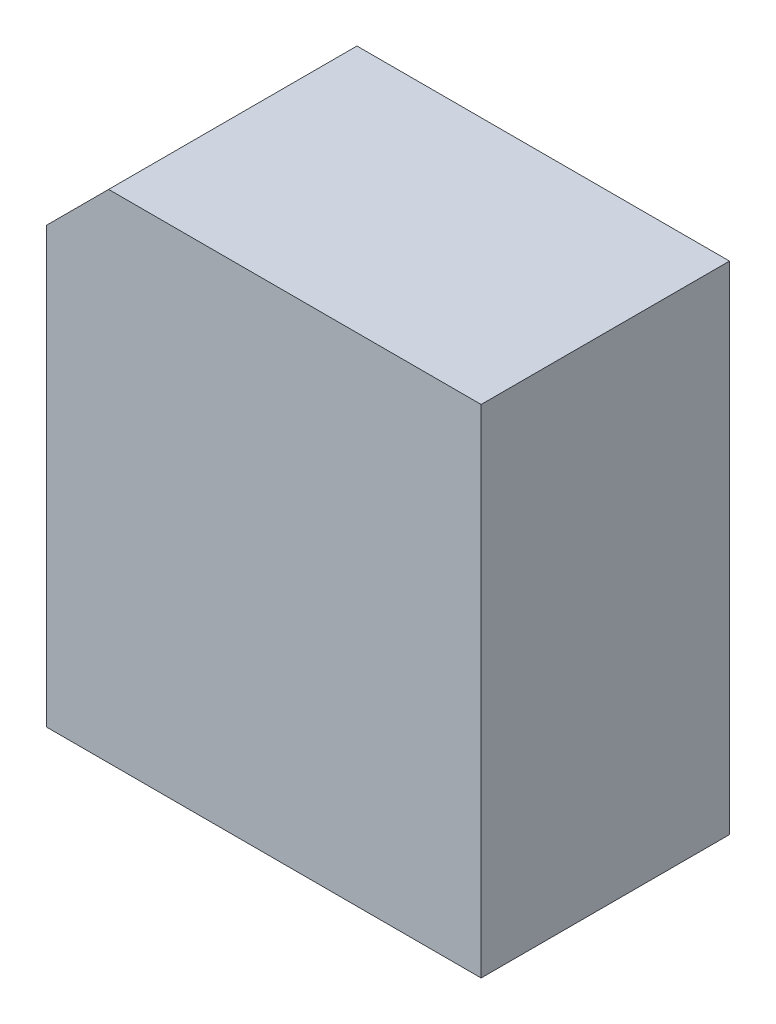
ISO-10303-21;
HEADER;
FILE_DESCRIPTION(('STEP AP214'),'2;1');
FILE_NAME('part.step','',(''),(''),'','','');
FILE_SCHEMA(('AUTOMOTIVE_DESIGN { 1 0 10303 214 1 1 1 1 }'));
ENDSEC;
DATA;
#1=APPLICATION_CONTEXT('core data for automotive mechanical design processes');
#2=APPLICATION_PROTOCOL_DEFINITION('international standard','automotive_design',2000,#1);
#3=PRODUCT_CONTEXT('',#1,'mechanical');
#4=PRODUCT('Part','Part','',(#3));
#5=PRODUCT_RELATED_PRODUCT_CATEGORY('part','',(#4));
#6=PRODUCT_DEFINITION_FORMATION('','',#4);
#7=PRODUCT_DEFINITION_CONTEXT('part definition',#1,'design');
#8=PRODUCT_DEFINITION('design','',#6,#7);
#9=PRODUCT_DEFINITION_SHAPE('','',#8);
#10=(LENGTH_UNIT() NAMED_UNIT(*) SI_UNIT(.MILLI.,.METRE.));
#11=(NAMED_UNIT(*) PLANE_ANGLE_UNIT() SI_UNIT($,.RADIAN.));
#12=(NAMED_UNIT(*) SI_UNIT($,.STERADIAN.) SOLID_ANGLE_UNIT());
#13=UNCERTAINTY_MEASURE_WITH_UNIT(LENGTH_MEASURE(1.E-05),#10,'distance_accuracy_value','');
#14=(GEOMETRIC_REPRESENTATION_CONTEXT(3) GLOBAL_UNCERTAINTY_ASSIGNED_CONTEXT((#13)) GLOBAL_UNIT_ASSIGNED_CONTEXT((#10,
#11,#12)) REPRESENTATION_CONTEXT('',''));
#15=CARTESIAN_POINT('',(0.,0.,0.));
#16=DIRECTION('',(0.,0.,1.));
#17=DIRECTION('',(1.,0.,0.));
#18=AXIS2_PLACEMENT_3D('',#15,#16,#17);
#19=CARTESIAN_POINT('',(-30.,40.,-40.));
#20=DIRECTION('',(1.,0.,0.));
#21=DIRECTION('',(0.,0.,1.));
#22=AXIS2_PLACEMENT_3D('',#19,#20,#21);
#23=PLANE('',#22);
#24=DIRECTION('',(0.,-1.,0.));
#25=VECTOR('',#24,1.);
#26=CARTESIAN_POINT('',(-30.,40.,-40.));
#27=LINE('',#26,#25);
#28=CARTESIAN_POINT('',(-30.,30.,-40.));
#29=VERTEX_POINT('',#28);
#30=CARTESIAN_POINT('',(-30.,-40.,-40.));
#31=VERTEX_POINT('',#30);
#32=EDGE_CURVE('E88',#29,#31,#27,.T.);
#33=ORIENTED_EDGE('',*,*,#32,.T.);
#34=DIRECTION('',(0.,0.,1.));
#35=VECTOR('',#34,1.);
#36=CARTESIAN_POINT('',(-30.,-40.,-40.));
#37=LINE('',#36,#35);
#38=CARTESIAN_POINT('',(-30.,-40.,0.));
#39=VERTEX_POINT('',#38);
#40=EDGE_CURVE('E96',#31,#39,#37,.T.);
#41=ORIENTED_EDGE('',*,*,#40,.T.);
#42=DIRECTION('',(0.,-1.,0.));
#43=VECTOR('',#42,1.);
#44=CARTESIAN_POINT('',(-30.,40.,0.));
#45=LINE('',#44,#43);
#46=CARTESIAN_POINT('',(-30.,30.,0.));
#47=VERTEX_POINT('',#46);
#48=EDGE_CURVE('E118',#47,#39,#45,.T.);
#49=ORIENTED_EDGE('',*,*,#48,.F.);
#50=DIRECTION('',(0.,0.,1.));
#51=VECTOR('',#50,1.);
#52=CARTESIAN_POINT('',(-30.,30.,-40.));
#53=LINE('',#52,#51);
#54=EDGE_CURVE('E103',#29,#47,#53,.T.);
#55=ORIENTED_EDGE('',*,*,#54,.F.);
#56=EDGE_LOOP('',(#33,#41,#49,#55));
#57=FACE_BOUND('',#56,.T.);
#58=ADVANCED_FACE('F41',(#57),#23,.F.);
#59=CARTESIAN_POINT('',(-30.,-40.,-40.));
#60=DIRECTION('',(0.,1.,0.));
#61=DIRECTION('',(0.,0.,-1.));
#62=AXIS2_PLACEMENT_3D('',#59,#60,#61);
#63=PLANE('',#62);
#64=DIRECTION('',(1.,0.,0.));
#65=VECTOR('',#64,1.);
#66=CARTESIAN_POINT('',(-30.,-40.,0.));
#67=LINE('',#66,#65);
#68=CARTESIAN_POINT('',(40.,-40.,0.));
#69=VERTEX_POINT('',#68);
#70=EDGE_CURVE('E99',#39,#69,#67,.T.);
#71=ORIENTED_EDGE('',*,*,#70,.F.);
#72=ORIENTED_EDGE('',*,*,#40,.F.);
#73=DIRECTION('',(1.,0.,0.));
#74=VECTOR('',#73,1.);
#75=CARTESIAN_POINT('',(-30.,-40.,-40.));
#76=LINE('',#75,#74);
#77=CARTESIAN_POINT('',(40.,-40.,-40.));
#78=VERTEX_POINT('',#77);
#79=EDGE_CURVE('E84',#31,#78,#76,.T.);
#80=ORIENTED_EDGE('',*,*,#79,.T.);
#81=DIRECTION('',(0.,0.,1.));
#82=VECTOR('',#81,1.);
#83=CARTESIAN_POINT('',(40.,-40.,-40.));
#84=LINE('',#83,#82);
#85=EDGE_CURVE('E104',#78,#69,#84,.T.);
#86=ORIENTED_EDGE('',*,*,#85,.T.);
#87=EDGE_LOOP('',(#71,#72,#80,#86));
#88=FACE_BOUND('',#87,.T.);
#89=ADVANCED_FACE('F97',(#88),#63,.F.);
#90=CARTESIAN_POINT('',(40.,40.,-40.));
#91=DIRECTION('',(-1.,0.,0.));
#92=DIRECTION('',(0.,0.,-1.));
#93=AXIS2_PLACEMENT_3D('',#90,#91,#92);
#94=PLANE('',#93);
#95=DIRECTION('',(0.,1.,0.));
#96=VECTOR('',#95,1.);
#97=CARTESIAN_POINT('',(40.,40.,0.));
#98=LINE('',#97,#96);
#99=CARTESIAN_POINT('',(40.,40.,0.));
#100=VERTEX_POINT('',#99);
#101=EDGE_CURVE('E110',#69,#100,#98,.T.);
#102=ORIENTED_EDGE('',*,*,#101,.F.);
#103=ORIENTED_EDGE('',*,*,#85,.F.);
#104=DIRECTION('',(0.,1.,0.));
#105=VECTOR('',#104,1.);
#106=CARTESIAN_POINT('',(40.,40.,-40.));
#107=LINE('',#106,#105);
#108=CARTESIAN_POINT('',(40.,40.,-40.));
#109=VERTEX_POINT('',#108);
#110=EDGE_CURVE('E90',#78,#109,#107,.T.);
#111=ORIENTED_EDGE('',*,*,#110,.T.);
#112=DIRECTION('',(0.,0.,1.));
#113=VECTOR('',#112,1.);
#114=CARTESIAN_POINT('',(40.,40.,-40.));
#115=LINE('',#114,#113);
#116=EDGE_CURVE('E117',#109,#100,#115,.T.);
#117=ORIENTED_EDGE('',*,*,#116,.T.);
#118=EDGE_LOOP('',(#102,#103,#111,#117));
#119=FACE_BOUND('',#118,.T.);
#120=ADVANCED_FACE('F131',(#119),#94,.F.);
#121=CARTESIAN_POINT('',(-30.,40.,-40.));
#122=DIRECTION('',(0.,-1.,0.));
#123=DIRECTION('',(0.,0.,1.));
#124=AXIS2_PLACEMENT_3D('',#121,#122,#123);
#125=PLANE('',#124);
#126=DIRECTION('',(-1.,0.,0.));
#127=VECTOR('',#126,1.);
#128=CARTESIAN_POINT('',(-30.,40.,0.));
#129=LINE('',#128,#127);
#130=CARTESIAN_POINT('',(-19.9999999999999,40.,0.));
#131=VERTEX_POINT('',#130);
#132=EDGE_CURVE('E107',#100,#131,#129,.T.);
#133=ORIENTED_EDGE('',*,*,#132,.F.);
#134=ORIENTED_EDGE('',*,*,#116,.F.);
#135=DIRECTION('',(-1.,0.,0.));
#136=VECTOR('',#135,1.);
#137=CARTESIAN_POINT('',(-30.,40.,-40.));
#138=LINE('',#137,#136);
#139=CARTESIAN_POINT('',(-19.9999999999999,40.,-40.));
#140=VERTEX_POINT('',#139);
#141=EDGE_CURVE('E114',#109,#140,#138,.T.);
#142=ORIENTED_EDGE('',*,*,#141,.T.);
#143=DIRECTION('',(0.,0.,-1.));
#144=VECTOR('',#143,1.);
#145=CARTESIAN_POINT('',(-19.9999999999999,40.,-40.));
#146=LINE('',#145,#144);
#147=EDGE_CURVE('E49',#131,#140,#146,.T.);
#148=ORIENTED_EDGE('',*,*,#147,.F.);
#149=EDGE_LOOP('',(#133,#134,#142,#148));
#150=FACE_BOUND('',#149,.T.);
#151=ADVANCED_FACE('F129',(#150),#125,.F.);
#152=CARTESIAN_POINT('',(-30.,-40.,-40.));
#153=DIRECTION('',(0.,0.,-1.));
#154=DIRECTION('',(1.,0.,0.));
#155=AXIS2_PLACEMENT_3D('',#152,#153,#154);
#156=PLANE('',#155);
#157=ORIENTED_EDGE('',*,*,#141,.F.);
#158=ORIENTED_EDGE('',*,*,#110,.F.);
#159=ORIENTED_EDGE('',*,*,#79,.F.);
#160=ORIENTED_EDGE('',*,*,#32,.F.);
#161=DIRECTION('',(0.707106781186549,0.707106781186546,0.));
#162=VECTOR('',#161,1.);
#163=CARTESIAN_POINT('',(-65.,-4.99999999999987,-40.));
#164=LINE('',#163,#162);
#165=EDGE_CURVE('E11',#140,#29,#164,.F.);
#166=ORIENTED_EDGE('',*,*,#165,.F.);
#167=EDGE_LOOP('',(#157,#158,#159,#160,#166));
#168=FACE_BOUND('',#167,.T.);
#169=ADVANCED_FACE('F86',(#168),#156,.T.);
#170=CARTESIAN_POINT('',(-30.,-40.,0.));
#171=DIRECTION('',(0.,0.,-1.));
#172=DIRECTION('',(1.,0.,0.));
#173=AXIS2_PLACEMENT_3D('',#170,#171,#172);
#174=PLANE('',#173);
#175=ORIENTED_EDGE('',*,*,#48,.T.);
#176=ORIENTED_EDGE('',*,*,#70,.T.);
#177=ORIENTED_EDGE('',*,*,#101,.T.);
#178=ORIENTED_EDGE('',*,*,#132,.T.);
#179=DIRECTION('',(-0.707106781186549,-0.707106781186546,0.));
#180=VECTOR('',#179,1.);
#181=CARTESIAN_POINT('',(-30.,30.,0.));
#182=LINE('',#181,#180);
#183=EDGE_CURVE('E61',#47,#131,#182,.F.);
#184=ORIENTED_EDGE('',*,*,#183,.F.);
#185=EDGE_LOOP('',(#175,#176,#177,#178,#184));
#186=FACE_BOUND('',#185,.T.);
#187=ADVANCED_FACE('F133',(#186),#174,.F.);
#188=CARTESIAN_POINT('',(-30.,30.,-40.));
#189=DIRECTION('',(0.707106781186546,-0.707106781186549,0.));
#190=DIRECTION('',(0.707106781186549,0.707106781186546,0.));
#191=AXIS2_PLACEMENT_3D('',#188,#189,#190);
#192=PLANE('',#191);
#193=ORIENTED_EDGE('',*,*,#165,.T.);
#194=ORIENTED_EDGE('',*,*,#54,.T.);
#195=ORIENTED_EDGE('',*,*,#183,.T.);
#196=ORIENTED_EDGE('',*,*,#147,.T.);
#197=EDGE_LOOP('',(#193,#194,#195,#196));
#198=FACE_BOUND('',#197,.T.);
#199=ADVANCED_FACE('F43',(#198),#192,.F.);
#200=CLOSED_SHELL('',(#58,#89,#120,#151,#169,#187,#199));
#201=MANIFOLD_SOLID_BREP('B2',#200);
#202=ADVANCED_BREP_SHAPE_REPRESENTATION('',(#18,#201),#14);
#203=SHAPE_DEFINITION_REPRESENTATION(#9,#202);
ENDSEC;
END-ISO-10303-21;
